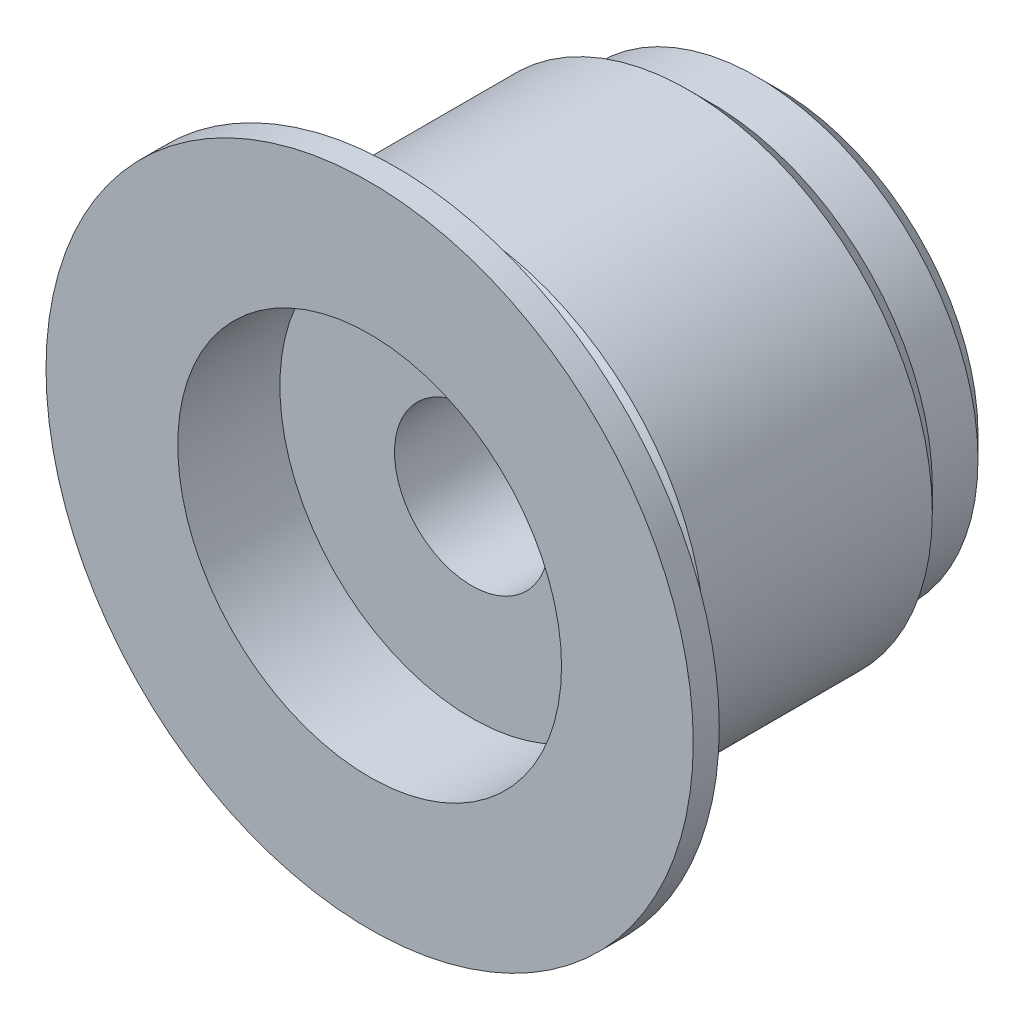
ISO-10303-21;
HEADER;
FILE_DESCRIPTION(('STEP AP214'),'2;1');
FILE_NAME('part.step','',(''),(''),'','','');
FILE_SCHEMA(('AUTOMOTIVE_DESIGN { 1 0 10303 214 1 1 1 1 }'));
ENDSEC;
DATA;
#1=APPLICATION_CONTEXT('core data for automotive mechanical design processes');
#2=APPLICATION_PROTOCOL_DEFINITION('international standard','automotive_design',2000,#1);
#3=PRODUCT_CONTEXT('',#1,'mechanical');
#4=PRODUCT('Part','Part','',(#3));
#5=PRODUCT_RELATED_PRODUCT_CATEGORY('part','',(#4));
#6=PRODUCT_DEFINITION_FORMATION('','',#4);
#7=PRODUCT_DEFINITION_CONTEXT('part definition',#1,'design');
#8=PRODUCT_DEFINITION('design','',#6,#7);
#9=PRODUCT_DEFINITION_SHAPE('','',#8);
#10=(LENGTH_UNIT() NAMED_UNIT(*) SI_UNIT(.MILLI.,.METRE.));
#11=(NAMED_UNIT(*) PLANE_ANGLE_UNIT() SI_UNIT($,.RADIAN.));
#12=(NAMED_UNIT(*) SI_UNIT($,.STERADIAN.) SOLID_ANGLE_UNIT());
#13=UNCERTAINTY_MEASURE_WITH_UNIT(LENGTH_MEASURE(1.E-05),#10,'distance_accuracy_value','');
#14=(GEOMETRIC_REPRESENTATION_CONTEXT(3) GLOBAL_UNCERTAINTY_ASSIGNED_CONTEXT((#13)) GLOBAL_UNIT_ASSIGNED_CONTEXT((#10,
#11,#12)) REPRESENTATION_CONTEXT('',''));
#15=CARTESIAN_POINT('',(0.,0.,0.));
#16=DIRECTION('',(0.,0.,1.));
#17=DIRECTION('',(1.,0.,0.));
#18=AXIS2_PLACEMENT_3D('',#15,#16,#17);
#19=CARTESIAN_POINT('',(-12.6365,0.,0.));
#20=DIRECTION('',(0.,0.,-1.));
#21=DIRECTION('',(-1.,0.,0.));
#22=AXIS2_PLACEMENT_3D('',#19,#20,#21);
#23=PLANE('',#22);
#24=CARTESIAN_POINT('',(0.,0.,0.));
#25=DIRECTION('',(0.,0.,1.));
#26=DIRECTION('',(1.,0.,0.));
#27=AXIS2_PLACEMENT_3D('',#24,#25,#26);
#28=CIRCLE('',#27,7.493);
#29=CARTESIAN_POINT('',(7.493,0.,0.));
#30=VERTEX_POINT('',#29);
#31=EDGE_CURVE('E11',#30,#30,#28,.T.);
#32=ORIENTED_EDGE('',*,*,#31,.F.);
#33=EDGE_LOOP('',(#32));
#34=FACE_BOUND('',#33,.T.);
#35=CARTESIAN_POINT('',(0.,0.,0.));
#36=DIRECTION('',(0.,0.,1.));
#37=DIRECTION('',(1.,0.,0.));
#38=AXIS2_PLACEMENT_3D('',#35,#36,#37);
#39=CIRCLE('',#38,12.6365);
#40=CARTESIAN_POINT('',(12.6365,0.,0.));
#41=VERTEX_POINT('',#40);
#42=EDGE_CURVE('E86',#41,#41,#39,.T.);
#43=ORIENTED_EDGE('',*,*,#42,.T.);
#44=EDGE_LOOP('',(#43));
#45=FACE_BOUND('',#44,.T.);
#46=ADVANCED_FACE('F39',(#34,#45),#23,.F.);
#47=CARTESIAN_POINT('',(0.,0.,0.));
#48=DIRECTION('',(0.,0.,1.));
#49=DIRECTION('',(1.,0.,0.));
#50=AXIS2_PLACEMENT_3D('',#47,#48,#49);
#51=CYLINDRICAL_SURFACE('',#50,7.493);
#52=CARTESIAN_POINT('',(0.,0.,-3.9878));
#53=DIRECTION('',(0.,0.,1.));
#54=DIRECTION('',(1.,0.,0.));
#55=AXIS2_PLACEMENT_3D('',#52,#53,#54);
#56=CIRCLE('',#55,7.493);
#57=CARTESIAN_POINT('',(7.493,0.,-3.9878));
#58=VERTEX_POINT('',#57);
#59=EDGE_CURVE('E46',#58,#58,#56,.T.);
#60=ORIENTED_EDGE('',*,*,#59,.F.);
#61=EDGE_LOOP('',(#60));
#62=FACE_BOUND('',#61,.T.);
#63=ORIENTED_EDGE('',*,*,#31,.T.);
#64=EDGE_LOOP('',(#63));
#65=FACE_BOUND('',#64,.T.);
#66=ADVANCED_FACE('F77',(#62,#65),#51,.F.);
#67=CARTESIAN_POINT('',(-3.01625,0.,-3.9878));
#68=DIRECTION('',(0.,0.,-1.));
#69=DIRECTION('',(-1.,0.,0.));
#70=AXIS2_PLACEMENT_3D('',#67,#68,#69);
#71=PLANE('',#70);
#72=CARTESIAN_POINT('',(0.,0.,-3.9878));
#73=DIRECTION('',(0.,0.,1.));
#74=DIRECTION('',(1.,0.,0.));
#75=AXIS2_PLACEMENT_3D('',#72,#73,#74);
#76=CIRCLE('',#75,3.01625);
#77=CARTESIAN_POINT('',(3.01625,0.,-3.9878));
#78=VERTEX_POINT('',#77);
#79=EDGE_CURVE('E60',#78,#78,#76,.T.);
#80=ORIENTED_EDGE('',*,*,#79,.F.);
#81=EDGE_LOOP('',(#80));
#82=FACE_BOUND('',#81,.T.);
#83=ORIENTED_EDGE('',*,*,#59,.T.);
#84=EDGE_LOOP('',(#83));
#85=FACE_BOUND('',#84,.T.);
#86=ADVANCED_FACE('F75',(#82,#85),#71,.F.);
#87=CARTESIAN_POINT('',(0.,0.,0.));
#88=DIRECTION('',(0.,0.,1.));
#89=DIRECTION('',(1.,0.,0.));
#90=AXIS2_PLACEMENT_3D('',#87,#88,#89);
#91=CYLINDRICAL_SURFACE('',#90,3.01625);
#92=CARTESIAN_POINT('',(0.,0.,-12.954));
#93=DIRECTION('',(0.,0.,1.));
#94=DIRECTION('',(1.,0.,0.));
#95=AXIS2_PLACEMENT_3D('',#92,#93,#94);
#96=CIRCLE('',#95,3.01625);
#97=CARTESIAN_POINT('',(3.01625,0.,-12.954));
#98=VERTEX_POINT('',#97);
#99=EDGE_CURVE('E57',#98,#98,#96,.T.);
#100=ORIENTED_EDGE('',*,*,#99,.F.);
#101=EDGE_LOOP('',(#100));
#102=FACE_BOUND('',#101,.T.);
#103=ORIENTED_EDGE('',*,*,#79,.T.);
#104=EDGE_LOOP('',(#103));
#105=FACE_BOUND('',#104,.T.);
#106=ADVANCED_FACE('F53',(#102,#105),#91,.F.);
#107=CARTESIAN_POINT('',(0.,0.,-12.954));
#108=DIRECTION('',(0.,0.,1.));
#109=DIRECTION('',(1.,0.,0.));
#110=AXIS2_PLACEMENT_3D('',#107,#108,#109);
#111=CONICAL_SURFACE('',#110,3.01625,1.02974425867666);
#112=CARTESIAN_POINT('',(0.,0.,-14.7663458421419));
#113=VERTEX_POINT('',#112);
#114=VERTEX_LOOP('',#113);
#115=FACE_BOUND('',#114,.T.);
#116=ORIENTED_EDGE('',*,*,#99,.T.);
#117=EDGE_LOOP('',(#116));
#118=FACE_BOUND('',#117,.T.);
#119=ADVANCED_FACE('F49',(#115,#118),#111,.F.);
#120=CARTESIAN_POINT('',(-7.75270152387406,0.,-16.002));
#121=DIRECTION('',(0.,0.,1.));
#122=DIRECTION('',(1.,0.,0.));
#123=AXIS2_PLACEMENT_3D('',#120,#121,#122);
#124=PLANE('',#123);
#125=CARTESIAN_POINT('',(0.,0.,-16.002));
#126=DIRECTION('',(0.,0.,1.));
#127=DIRECTION('',(1.,0.,0.));
#128=AXIS2_PLACEMENT_3D('',#125,#126,#127);
#129=CIRCLE('',#128,7.75270152387406);
#130=CARTESIAN_POINT('',(7.75270152387406,0.,-16.002));
#131=VERTEX_POINT('',#130);
#132=EDGE_CURVE('E61',#131,#131,#129,.T.);
#133=ORIENTED_EDGE('',*,*,#132,.F.);
#134=EDGE_LOOP('',(#133));
#135=FACE_BOUND('',#134,.T.);
#136=ADVANCED_FACE('F52',(#135),#124,.F.);
#137=CARTESIAN_POINT('',(0.,0.,-16.002));
#138=DIRECTION('',(0.,0.,1.));
#139=DIRECTION('',(1.,0.,0.));
#140=AXIS2_PLACEMENT_3D('',#137,#138,#139);
#141=CONICAL_SURFACE('',#140,7.75270152387406,0.785398163397443);
#142=CARTESIAN_POINT('',(0.,0.,-15.127727135981));
#143=DIRECTION('',(0.,0.,1.));
#144=DIRECTION('',(1.,0.,0.));
#145=AXIS2_PLACEMENT_3D('',#142,#143,#144);
#146=CIRCLE('',#145,8.62697438789309);
#147=CARTESIAN_POINT('',(8.62697438789309,0.,-15.127727135981));
#148=VERTEX_POINT('',#147);
#149=EDGE_CURVE('E68',#148,#148,#146,.T.);
#150=ORIENTED_EDGE('',*,*,#149,.F.);
#151=EDGE_LOOP('',(#150));
#152=FACE_BOUND('',#151,.T.);
#153=ORIENTED_EDGE('',*,*,#132,.T.);
#154=EDGE_LOOP('',(#153));
#155=FACE_BOUND('',#154,.T.);
#156=ADVANCED_FACE('F116',(#152,#155),#141,.T.);
#157=CARTESIAN_POINT('',(0.,0.,0.));
#158=DIRECTION('',(0.,0.,1.));
#159=DIRECTION('',(1.,0.,0.));
#160=AXIS2_PLACEMENT_3D('',#157,#158,#159);
#161=CYLINDRICAL_SURFACE('',#160,8.62697438789309);
#162=CARTESIAN_POINT('',(0.,0.,-13.3440256121069));
#163=DIRECTION('',(0.,0.,1.));
#164=DIRECTION('',(1.,0.,0.));
#165=AXIS2_PLACEMENT_3D('',#162,#163,#164);
#166=CIRCLE('',#165,8.62697438789309);
#167=CARTESIAN_POINT('',(8.62697438789309,0.,-13.3440256121069));
#168=VERTEX_POINT('',#167);
#169=EDGE_CURVE('E107',#168,#168,#166,.T.);
#170=ORIENTED_EDGE('',*,*,#169,.F.);
#171=EDGE_LOOP('',(#170));
#172=FACE_BOUND('',#171,.T.);
#173=ORIENTED_EDGE('',*,*,#149,.T.);
#174=EDGE_LOOP('',(#173));
#175=FACE_BOUND('',#174,.T.);
#176=ADVANCED_FACE('F114',(#172,#175),#161,.T.);
#177=CARTESIAN_POINT('',(0.,0.,-13.3440256121069));
#178=DIRECTION('',(0.,0.,1.));
#179=DIRECTION('',(1.,0.,0.));
#180=AXIS2_PLACEMENT_3D('',#177,#178,#179);
#181=CONICAL_SURFACE('',#180,8.62697438789309,0.785398163397447);
#182=CARTESIAN_POINT('',(0.,0.,-12.446));
#183=DIRECTION('',(0.,0.,1.));
#184=DIRECTION('',(1.,0.,0.));
#185=AXIS2_PLACEMENT_3D('',#182,#183,#184);
#186=CIRCLE('',#185,9.52500000000001);
#187=CARTESIAN_POINT('',(9.52500000000001,0.,-12.446));
#188=VERTEX_POINT('',#187);
#189=EDGE_CURVE('E103',#188,#188,#186,.T.);
#190=ORIENTED_EDGE('',*,*,#189,.F.);
#191=EDGE_LOOP('',(#190));
#192=FACE_BOUND('',#191,.T.);
#193=ORIENTED_EDGE('',*,*,#169,.T.);
#194=EDGE_LOOP('',(#193));
#195=FACE_BOUND('',#194,.T.);
#196=ADVANCED_FACE('F165',(#192,#195),#181,.T.);
#197=CARTESIAN_POINT('',(0.,0.,0.));
#198=DIRECTION('',(0.,0.,1.));
#199=DIRECTION('',(1.,0.,0.));
#200=AXIS2_PLACEMENT_3D('',#197,#198,#199);
#201=CYLINDRICAL_SURFACE('',#200,9.52500000000001);
#202=CARTESIAN_POINT('',(0.,0.,-3.556));
#203=DIRECTION('',(0.,0.,1.));
#204=DIRECTION('',(1.,0.,0.));
#205=AXIS2_PLACEMENT_3D('',#202,#203,#204);
#206=CIRCLE('',#205,9.525);
#207=CARTESIAN_POINT('',(9.525,0.,-3.556));
#208=VERTEX_POINT('',#207);
#209=EDGE_CURVE('E99',#208,#208,#206,.T.);
#210=ORIENTED_EDGE('',*,*,#209,.F.);
#211=EDGE_LOOP('',(#210));
#212=FACE_BOUND('',#211,.T.);
#213=ORIENTED_EDGE('',*,*,#189,.T.);
#214=EDGE_LOOP('',(#213));
#215=FACE_BOUND('',#214,.T.);
#216=ADVANCED_FACE('F174',(#212,#215),#201,.T.);
#217=CARTESIAN_POINT('',(0.,0.,-3.556));
#218=DIRECTION('',(0.,0.,-1.));
#219=DIRECTION('',(-1.,0.,0.));
#220=AXIS2_PLACEMENT_3D('',#217,#218,#219);
#221=CONICAL_SURFACE('',#220,9.525,0.785398163397467);
#222=CARTESIAN_POINT('',(0.,0.,-2.99276937584463));
#223=DIRECTION('',(0.,0.,1.));
#224=DIRECTION('',(1.,0.,0.));
#225=AXIS2_PLACEMENT_3D('',#222,#223,#224);
#226=CIRCLE('',#225,8.96176937584461);
#227=CARTESIAN_POINT('',(8.96176937584461,0.,-2.99276937584463));
#228=VERTEX_POINT('',#227);
#229=EDGE_CURVE('E93',#228,#228,#226,.T.);
#230=ORIENTED_EDGE('',*,*,#229,.F.);
#231=EDGE_LOOP('',(#230));
#232=FACE_BOUND('',#231,.T.);
#233=ORIENTED_EDGE('',*,*,#209,.T.);
#234=EDGE_LOOP('',(#233));
#235=FACE_BOUND('',#234,.T.);
#236=ADVANCED_FACE('F184',(#232,#235),#221,.T.);
#237=CARTESIAN_POINT('',(0.,0.,-2.99276937584463));
#238=DIRECTION('',(0.,0.,1.));
#239=DIRECTION('',(1.,0.,0.));
#240=AXIS2_PLACEMENT_3D('',#237,#238,#239);
#241=CONICAL_SURFACE('',#240,8.96176937584461,1.07726256924871);
#242=CARTESIAN_POINT('',(0.,0.,-1.016));
#243=DIRECTION('',(0.,0.,1.));
#244=DIRECTION('',(1.,0.,0.));
#245=AXIS2_PLACEMENT_3D('',#242,#243,#244);
#246=CIRCLE('',#245,12.6365);
#247=CARTESIAN_POINT('',(12.6365,0.,-1.016));
#248=VERTEX_POINT('',#247);
#249=EDGE_CURVE('E89',#248,#248,#246,.T.);
#250=ORIENTED_EDGE('',*,*,#249,.F.);
#251=EDGE_LOOP('',(#250));
#252=FACE_BOUND('',#251,.T.);
#253=ORIENTED_EDGE('',*,*,#229,.T.);
#254=EDGE_LOOP('',(#253));
#255=FACE_BOUND('',#254,.T.);
#256=ADVANCED_FACE('F194',(#252,#255),#241,.T.);
#257=CARTESIAN_POINT('',(0.,0.,0.));
#258=DIRECTION('',(0.,0.,1.));
#259=DIRECTION('',(1.,0.,0.));
#260=AXIS2_PLACEMENT_3D('',#257,#258,#259);
#261=CYLINDRICAL_SURFACE('',#260,12.6365);
#262=ORIENTED_EDGE('',*,*,#42,.F.);
#263=EDGE_LOOP('',(#262));
#264=FACE_BOUND('',#263,.T.);
#265=ORIENTED_EDGE('',*,*,#249,.T.);
#266=EDGE_LOOP('',(#265));
#267=FACE_BOUND('',#266,.T.);
#268=ADVANCED_FACE('F204',(#264,#267),#261,.T.);
#269=CLOSED_SHELL('',(#46,#66,#86,#106,#119,#136,#156,#176,#196,#216,#236,#256,#268));
#270=MANIFOLD_SOLID_BREP('B2',#269);
#271=ADVANCED_BREP_SHAPE_REPRESENTATION('',(#18,#270),#14);
#272=SHAPE_DEFINITION_REPRESENTATION(#9,#271);
ENDSEC;
END-ISO-10303-21;
